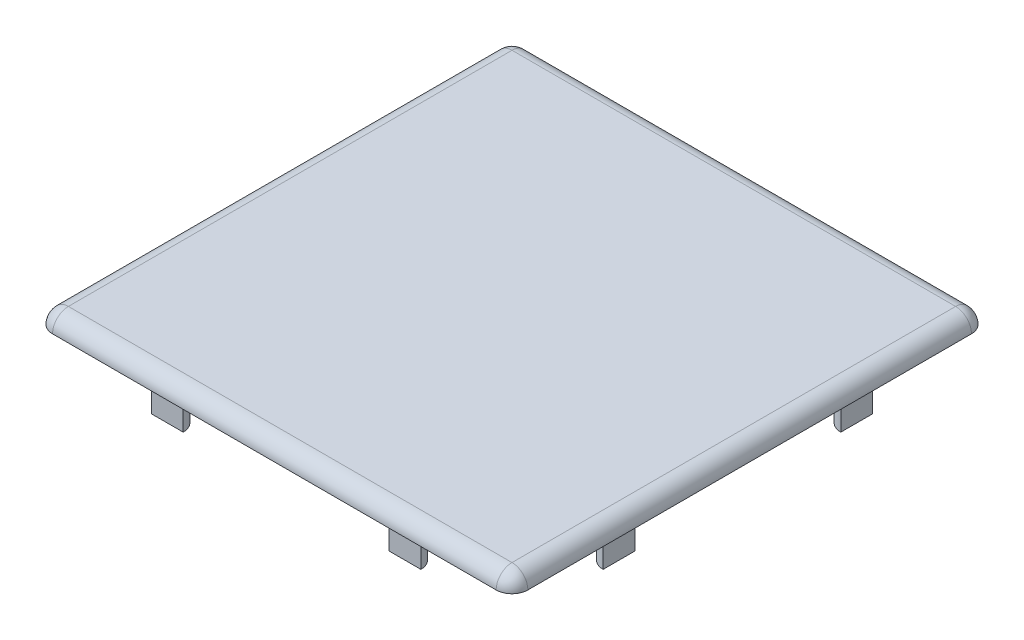
ISO-10303-21;
HEADER;
FILE_DESCRIPTION(('STEP AP214'),'2;1');
FILE_NAME('part.step','',(''),(''),'','','');
FILE_SCHEMA(('AUTOMOTIVE_DESIGN { 1 0 10303 214 1 1 1 1 }'));
ENDSEC;
DATA;
#1=APPLICATION_CONTEXT('core data for automotive mechanical design processes');
#2=APPLICATION_PROTOCOL_DEFINITION('international standard','automotive_design',2000,#1);
#3=PRODUCT_CONTEXT('',#1,'mechanical');
#4=PRODUCT('Part','Part','',(#3));
#5=PRODUCT_RELATED_PRODUCT_CATEGORY('part','',(#4));
#6=PRODUCT_DEFINITION_FORMATION('','',#4);
#7=PRODUCT_DEFINITION_CONTEXT('part definition',#1,'design');
#8=PRODUCT_DEFINITION('design','',#6,#7);
#9=PRODUCT_DEFINITION_SHAPE('','',#8);
#10=(LENGTH_UNIT() NAMED_UNIT(*) SI_UNIT(.MILLI.,.METRE.));
#11=(NAMED_UNIT(*) PLANE_ANGLE_UNIT() SI_UNIT($,.RADIAN.));
#12=(NAMED_UNIT(*) SI_UNIT($,.STERADIAN.) SOLID_ANGLE_UNIT());
#13=UNCERTAINTY_MEASURE_WITH_UNIT(LENGTH_MEASURE(1.E-05),#10,'distance_accuracy_value','');
#14=(GEOMETRIC_REPRESENTATION_CONTEXT(3) GLOBAL_UNCERTAINTY_ASSIGNED_CONTEXT((#13)) GLOBAL_UNIT_ASSIGNED_CONTEXT((#10,
#11,#12)) REPRESENTATION_CONTEXT('',''));
#15=CARTESIAN_POINT('',(0.,0.,0.));
#16=DIRECTION('',(0.,0.,1.));
#17=DIRECTION('',(1.,0.,0.));
#18=AXIS2_PLACEMENT_3D('',#15,#16,#17);
#19=CARTESIAN_POINT('',(0.,0.,0.));
#20=DIRECTION('',(0.,1.,0.));
#21=DIRECTION('',(0.,0.,1.));
#22=AXIS2_PLACEMENT_3D('',#19,#20,#21);
#23=PLANE('',#22);
#24=CARTESIAN_POINT('',(-15.,0.,28.5));
#25=DIRECTION('',(0.,-1.,0.));
#26=DIRECTION('',(0.,0.,-1.));
#27=AXIS2_PLACEMENT_3D('',#24,#25,#26);
#28=CIRCLE('',#27,2.);
#29=CARTESIAN_POINT('',(-17.,0.,28.5));
#30=VERTEX_POINT('',#29);
#31=CARTESIAN_POINT('',(-13.,0.,28.5));
#32=VERTEX_POINT('',#31);
#33=EDGE_CURVE('E240',#30,#32,#28,.T.);
#34=ORIENTED_EDGE('',*,*,#33,.F.);
#35=DIRECTION('',(-1.,0.,0.));
#36=VECTOR('',#35,1.);
#37=CARTESIAN_POINT('',(-13.,0.,28.5));
#38=LINE('',#37,#36);
#39=EDGE_CURVE('E245',#32,#30,#38,.T.);
#40=ORIENTED_EDGE('',*,*,#39,.F.);
#41=EDGE_LOOP('',(#34,#40));
#42=FACE_BOUND('',#41,.T.);
#43=CARTESIAN_POINT('',(-28.5,0.,15.));
#44=DIRECTION('',(0.,-1.,0.));
#45=DIRECTION('',(0.,0.,-1.));
#46=AXIS2_PLACEMENT_3D('',#43,#44,#45);
#47=CIRCLE('',#46,2.);
#48=CARTESIAN_POINT('',(-28.5,0.,13.));
#49=VERTEX_POINT('',#48);
#50=CARTESIAN_POINT('',(-28.5,0.,17.));
#51=VERTEX_POINT('',#50);
#52=EDGE_CURVE('E308',#49,#51,#47,.T.);
#53=ORIENTED_EDGE('',*,*,#52,.F.);
#54=DIRECTION('',(0.,0.,-1.));
#55=VECTOR('',#54,1.);
#56=CARTESIAN_POINT('',(-28.5,0.,13.));
#57=LINE('',#56,#55);
#58=EDGE_CURVE('E313',#51,#49,#57,.T.);
#59=ORIENTED_EDGE('',*,*,#58,.F.);
#60=EDGE_LOOP('',(#53,#59));
#61=FACE_BOUND('',#60,.T.);
#62=DIRECTION('',(0.,0.,-1.));
#63=VECTOR('',#62,1.);
#64=CARTESIAN_POINT('',(30.,0.,-30.));
#65=LINE('',#64,#63);
#66=CARTESIAN_POINT('',(30.,0.,28.));
#67=VERTEX_POINT('',#66);
#68=CARTESIAN_POINT('',(30.,0.,-28.));
#69=VERTEX_POINT('',#68);
#70=EDGE_CURVE('E332',#67,#69,#65,.T.);
#71=ORIENTED_EDGE('',*,*,#70,.F.);
#72=CARTESIAN_POINT('',(28.,0.,28.));
#73=DIRECTION('',(0.,1.,0.));
#74=DIRECTION('',(0.,0.,1.));
#75=AXIS2_PLACEMENT_3D('',#72,#73,#74);
#76=CIRCLE('',#75,2.);
#77=CARTESIAN_POINT('',(28.,0.,30.));
#78=VERTEX_POINT('',#77);
#79=EDGE_CURVE('E11',#67,#78,#76,.F.);
#80=ORIENTED_EDGE('',*,*,#79,.T.);
#81=DIRECTION('',(1.,0.,0.));
#82=VECTOR('',#81,1.);
#83=CARTESIAN_POINT('',(30.,0.,30.));
#84=LINE('',#83,#82);
#85=CARTESIAN_POINT('',(-28.,0.,30.));
#86=VERTEX_POINT('',#85);
#87=EDGE_CURVE('E329',#86,#78,#84,.T.);
#88=ORIENTED_EDGE('',*,*,#87,.F.);
#89=CARTESIAN_POINT('',(-28.,0.,28.));
#90=DIRECTION('',(0.,1.,0.));
#91=DIRECTION('',(0.,0.,1.));
#92=AXIS2_PLACEMENT_3D('',#89,#90,#91);
#93=CIRCLE('',#92,2.);
#94=CARTESIAN_POINT('',(-30.,0.,28.));
#95=VERTEX_POINT('',#94);
#96=EDGE_CURVE('E344',#86,#95,#93,.F.);
#97=ORIENTED_EDGE('',*,*,#96,.T.);
#98=DIRECTION('',(0.,0.,1.));
#99=VECTOR('',#98,1.);
#100=CARTESIAN_POINT('',(-30.,0.,-30.));
#101=LINE('',#100,#99);
#102=CARTESIAN_POINT('',(-30.,0.,-28.));
#103=VERTEX_POINT('',#102);
#104=EDGE_CURVE('E326',#103,#95,#101,.T.);
#105=ORIENTED_EDGE('',*,*,#104,.F.);
#106=CARTESIAN_POINT('',(-28.,0.,-28.));
#107=DIRECTION('',(0.,1.,0.));
#108=DIRECTION('',(0.,0.,1.));
#109=AXIS2_PLACEMENT_3D('',#106,#107,#108);
#110=CIRCLE('',#109,2.);
#111=CARTESIAN_POINT('',(-28.,0.,-30.));
#112=VERTEX_POINT('',#111);
#113=EDGE_CURVE('E51',#103,#112,#110,.F.);
#114=ORIENTED_EDGE('',*,*,#113,.T.);
#115=DIRECTION('',(-1.,0.,0.));
#116=VECTOR('',#115,1.);
#117=CARTESIAN_POINT('',(30.,0.,-30.));
#118=LINE('',#117,#116);
#119=CARTESIAN_POINT('',(28.,0.,-30.));
#120=VERTEX_POINT('',#119);
#121=EDGE_CURVE('E56',#120,#112,#118,.T.);
#122=ORIENTED_EDGE('',*,*,#121,.F.);
#123=CARTESIAN_POINT('',(28.,0.,-28.));
#124=DIRECTION('',(0.,1.,0.));
#125=DIRECTION('',(0.,0.,1.));
#126=AXIS2_PLACEMENT_3D('',#123,#124,#125);
#127=CIRCLE('',#126,2.);
#128=EDGE_CURVE('E43',#120,#69,#127,.F.);
#129=ORIENTED_EDGE('',*,*,#128,.T.);
#130=EDGE_LOOP('',(#71,#80,#88,#97,#105,#114,#122,#129));
#131=FACE_BOUND('',#130,.T.);
#132=DIRECTION('',(0.,0.,1.));
#133=VECTOR('',#132,1.);
#134=CARTESIAN_POINT('',(-28.5,0.,-13.));
#135=LINE('',#134,#133);
#136=CARTESIAN_POINT('',(-28.5,0.,-17.));
#137=VERTEX_POINT('',#136);
#138=CARTESIAN_POINT('',(-28.5,0.,-13.));
#139=VERTEX_POINT('',#138);
#140=EDGE_CURVE('E296',#137,#139,#135,.T.);
#141=ORIENTED_EDGE('',*,*,#140,.T.);
#142=CARTESIAN_POINT('',(-28.5,0.,-15.));
#143=DIRECTION('',(0.,1.,0.));
#144=DIRECTION('',(0.,0.,1.));
#145=AXIS2_PLACEMENT_3D('',#142,#143,#144);
#146=CIRCLE('',#145,2.);
#147=EDGE_CURVE('E291',#139,#137,#146,.T.);
#148=ORIENTED_EDGE('',*,*,#147,.T.);
#149=EDGE_LOOP('',(#141,#148));
#150=FACE_BOUND('',#149,.T.);
#151=DIRECTION('',(0.,0.,-1.));
#152=VECTOR('',#151,1.);
#153=CARTESIAN_POINT('',(28.5,0.,13.));
#154=LINE('',#153,#152);
#155=CARTESIAN_POINT('',(28.5,0.,17.));
#156=VERTEX_POINT('',#155);
#157=CARTESIAN_POINT('',(28.5,0.,13.));
#158=VERTEX_POINT('',#157);
#159=EDGE_CURVE('E279',#156,#158,#154,.T.);
#160=ORIENTED_EDGE('',*,*,#159,.T.);
#161=CARTESIAN_POINT('',(28.5,0.,15.));
#162=DIRECTION('',(0.,1.,0.));
#163=DIRECTION('',(0.,0.,-1.));
#164=AXIS2_PLACEMENT_3D('',#161,#162,#163);
#165=CIRCLE('',#164,2.);
#166=EDGE_CURVE('E274',#158,#156,#165,.T.);
#167=ORIENTED_EDGE('',*,*,#166,.T.);
#168=EDGE_LOOP('',(#160,#167));
#169=FACE_BOUND('',#168,.T.);
#170=CARTESIAN_POINT('',(28.5,0.,-15.));
#171=DIRECTION('',(0.,-1.,0.));
#172=DIRECTION('',(0.,0.,1.));
#173=AXIS2_PLACEMENT_3D('',#170,#171,#172);
#174=CIRCLE('',#173,2.);
#175=CARTESIAN_POINT('',(28.5,0.,-13.));
#176=VERTEX_POINT('',#175);
#177=CARTESIAN_POINT('',(28.5,0.,-17.));
#178=VERTEX_POINT('',#177);
#179=EDGE_CURVE('E257',#176,#178,#174,.T.);
#180=ORIENTED_EDGE('',*,*,#179,.F.);
#181=DIRECTION('',(0.,0.,1.));
#182=VECTOR('',#181,1.);
#183=CARTESIAN_POINT('',(28.5,0.,-13.));
#184=LINE('',#183,#182);
#185=EDGE_CURVE('E262',#178,#176,#184,.T.);
#186=ORIENTED_EDGE('',*,*,#185,.F.);
#187=EDGE_LOOP('',(#180,#186));
#188=FACE_BOUND('',#187,.T.);
#189=DIRECTION('',(1.,0.,0.));
#190=VECTOR('',#189,1.);
#191=CARTESIAN_POINT('',(13.,0.,28.5));
#192=LINE('',#191,#190);
#193=CARTESIAN_POINT('',(13.,0.,28.5));
#194=VERTEX_POINT('',#193);
#195=CARTESIAN_POINT('',(17.,0.,28.5));
#196=VERTEX_POINT('',#195);
#197=EDGE_CURVE('E228',#194,#196,#192,.T.);
#198=ORIENTED_EDGE('',*,*,#197,.T.);
#199=CARTESIAN_POINT('',(15.,0.,28.5));
#200=DIRECTION('',(0.,1.,0.));
#201=DIRECTION('',(0.,0.,-1.));
#202=AXIS2_PLACEMENT_3D('',#199,#200,#201);
#203=CIRCLE('',#202,2.);
#204=EDGE_CURVE('E223',#196,#194,#203,.T.);
#205=ORIENTED_EDGE('',*,*,#204,.T.);
#206=EDGE_LOOP('',(#198,#205));
#207=FACE_BOUND('',#206,.T.);
#208=DIRECTION('',(-1.,0.,0.));
#209=VECTOR('',#208,1.);
#210=CARTESIAN_POINT('',(-13.,0.,-28.5));
#211=LINE('',#210,#209);
#212=CARTESIAN_POINT('',(-13.,0.,-28.5));
#213=VERTEX_POINT('',#212);
#214=CARTESIAN_POINT('',(-17.,0.,-28.5));
#215=VERTEX_POINT('',#214);
#216=EDGE_CURVE('E205',#213,#215,#211,.T.);
#217=ORIENTED_EDGE('',*,*,#216,.T.);
#218=CARTESIAN_POINT('',(-15.,0.,-28.5));
#219=DIRECTION('',(0.,1.,0.));
#220=DIRECTION('',(0.,0.,1.));
#221=AXIS2_PLACEMENT_3D('',#218,#219,#220);
#222=CIRCLE('',#221,2.);
#223=EDGE_CURVE('E202',#215,#213,#222,.T.);
#224=ORIENTED_EDGE('',*,*,#223,.T.);
#225=EDGE_LOOP('',(#217,#224));
#226=FACE_BOUND('',#225,.T.);
#227=CARTESIAN_POINT('',(15.,0.,-28.5));
#228=DIRECTION('',(0.,-1.,0.));
#229=DIRECTION('',(0.,0.,1.));
#230=AXIS2_PLACEMENT_3D('',#227,#228,#229);
#231=CIRCLE('',#230,2.);
#232=CARTESIAN_POINT('',(17.,0.,-28.5));
#233=VERTEX_POINT('',#232);
#234=CARTESIAN_POINT('',(13.,0.,-28.5));
#235=VERTEX_POINT('',#234);
#236=EDGE_CURVE('E201',#233,#235,#231,.T.);
#237=ORIENTED_EDGE('',*,*,#236,.F.);
#238=DIRECTION('',(1.,0.,0.));
#239=VECTOR('',#238,1.);
#240=CARTESIAN_POINT('',(13.,0.,-28.5));
#241=LINE('',#240,#239);
#242=EDGE_CURVE('E198',#235,#233,#241,.T.);
#243=ORIENTED_EDGE('',*,*,#242,.F.);
#244=EDGE_LOOP('',(#237,#243));
#245=FACE_BOUND('',#244,.T.);
#246=ADVANCED_FACE('F34',(#42,#61,#131,#150,#169,#188,#207,#226,#245),#23,.F.);
#247=CARTESIAN_POINT('',(0.,2.,0.));
#248=DIRECTION('',(0.,1.,0.));
#249=DIRECTION('',(0.,0.,1.));
#250=AXIS2_PLACEMENT_3D('',#247,#248,#249);
#251=PLANE('',#250);
#252=DIRECTION('',(1.,0.,0.));
#253=VECTOR('',#252,1.);
#254=CARTESIAN_POINT('',(30.,2.,28.));
#255=LINE('',#254,#253);
#256=CARTESIAN_POINT('',(-28.,2.,28.));
#257=VERTEX_POINT('',#256);
#258=CARTESIAN_POINT('',(28.,2.,28.));
#259=VERTEX_POINT('',#258);
#260=EDGE_CURVE('E339',#257,#259,#255,.T.);
#261=ORIENTED_EDGE('',*,*,#260,.T.);
#262=DIRECTION('',(0.,0.,-1.));
#263=VECTOR('',#262,1.);
#264=CARTESIAN_POINT('',(28.,2.,-30.));
#265=LINE('',#264,#263);
#266=CARTESIAN_POINT('',(28.,2.,-28.));
#267=VERTEX_POINT('',#266);
#268=EDGE_CURVE('E341',#259,#267,#265,.T.);
#269=ORIENTED_EDGE('',*,*,#268,.T.);
#270=DIRECTION('',(-1.,0.,0.));
#271=VECTOR('',#270,1.);
#272=CARTESIAN_POINT('',(-30.,2.,-28.));
#273=LINE('',#272,#271);
#274=CARTESIAN_POINT('',(-28.,2.,-28.));
#275=VERTEX_POINT('',#274);
#276=EDGE_CURVE('E335',#267,#275,#273,.T.);
#277=ORIENTED_EDGE('',*,*,#276,.T.);
#278=DIRECTION('',(0.,0.,1.));
#279=VECTOR('',#278,1.);
#280=CARTESIAN_POINT('',(-28.,2.,30.));
#281=LINE('',#280,#279);
#282=EDGE_CURVE('E337',#275,#257,#281,.T.);
#283=ORIENTED_EDGE('',*,*,#282,.T.);
#284=EDGE_LOOP('',(#261,#269,#277,#283));
#285=FACE_BOUND('',#284,.T.);
#286=ADVANCED_FACE('F375',(#285),#251,.T.);
#287=CARTESIAN_POINT('',(-28.5,-4.,15.));
#288=DIRECTION('',(0.,1.,0.));
#289=DIRECTION('',(0.,0.,1.));
#290=AXIS2_PLACEMENT_3D('',#287,#288,#289);
#291=CYLINDRICAL_SURFACE('',#290,2.);
#292=ORIENTED_EDGE('',*,*,#52,.T.);
#293=DIRECTION('',(0.,1.,0.));
#294=VECTOR('',#293,1.);
#295=CARTESIAN_POINT('',(-28.5,-4.,17.));
#296=LINE('',#295,#294);
#297=CARTESIAN_POINT('',(-28.5,-4.,17.));
#298=VERTEX_POINT('',#297);
#299=EDGE_CURVE('E322',#298,#51,#296,.T.);
#300=ORIENTED_EDGE('',*,*,#299,.F.);
#301=CARTESIAN_POINT('',(-28.5,-4.,15.));
#302=DIRECTION('',(0.,-1.,0.));
#303=DIRECTION('',(0.,0.,-1.));
#304=AXIS2_PLACEMENT_3D('',#301,#302,#303);
#305=CIRCLE('',#304,2.);
#306=CARTESIAN_POINT('',(-28.5,-4.,13.));
#307=VERTEX_POINT('',#306);
#308=EDGE_CURVE('E309',#307,#298,#305,.T.);
#309=ORIENTED_EDGE('',*,*,#308,.F.);
#310=DIRECTION('',(0.,1.,0.));
#311=VECTOR('',#310,1.);
#312=CARTESIAN_POINT('',(-28.5,-4.,13.));
#313=LINE('',#312,#311);
#314=EDGE_CURVE('E315',#307,#49,#313,.T.);
#315=ORIENTED_EDGE('',*,*,#314,.T.);
#316=EDGE_LOOP('',(#292,#300,#309,#315));
#317=FACE_BOUND('',#316,.T.);
#318=ADVANCED_FACE('F381',(#317),#291,.T.);
#319=CARTESIAN_POINT('',(-28.5,-4.,13.));
#320=DIRECTION('',(1.,0.,0.));
#321=DIRECTION('',(0.,0.,-1.));
#322=AXIS2_PLACEMENT_3D('',#319,#320,#321);
#323=PLANE('',#322);
#324=ORIENTED_EDGE('',*,*,#58,.T.);
#325=ORIENTED_EDGE('',*,*,#314,.F.);
#326=DIRECTION('',(0.,0.,-1.));
#327=VECTOR('',#326,1.);
#328=CARTESIAN_POINT('',(-28.5,-4.,13.));
#329=LINE('',#328,#327);
#330=EDGE_CURVE('E312',#298,#307,#329,.T.);
#331=ORIENTED_EDGE('',*,*,#330,.F.);
#332=ORIENTED_EDGE('',*,*,#299,.T.);
#333=EDGE_LOOP('',(#324,#325,#331,#332));
#334=FACE_BOUND('',#333,.T.);
#335=ADVANCED_FACE('F521',(#334),#323,.F.);
#336=CARTESIAN_POINT('',(-28.5,-4.,15.));
#337=DIRECTION('',(0.,-1.,0.));
#338=DIRECTION('',(0.,0.,-1.));
#339=AXIS2_PLACEMENT_3D('',#336,#337,#338);
#340=PLANE('',#339);
#341=ORIENTED_EDGE('',*,*,#308,.T.);
#342=ORIENTED_EDGE('',*,*,#330,.T.);
#343=EDGE_LOOP('',(#341,#342));
#344=FACE_BOUND('',#343,.T.);
#345=ADVANCED_FACE('F517',(#344),#340,.T.);
#346=CARTESIAN_POINT('',(-28.5,-4.,-15.));
#347=DIRECTION('',(0.,1.,0.));
#348=DIRECTION('',(0.,0.,1.));
#349=AXIS2_PLACEMENT_3D('',#346,#347,#348);
#350=CYLINDRICAL_SURFACE('',#349,2.);
#351=ORIENTED_EDGE('',*,*,#147,.F.);
#352=DIRECTION('',(0.,1.,0.));
#353=VECTOR('',#352,1.);
#354=CARTESIAN_POINT('',(-28.5,-4.,-13.));
#355=LINE('',#354,#353);
#356=CARTESIAN_POINT('',(-28.5,-4.,-13.));
#357=VERTEX_POINT('',#356);
#358=EDGE_CURVE('E305',#357,#139,#355,.T.);
#359=ORIENTED_EDGE('',*,*,#358,.F.);
#360=CARTESIAN_POINT('',(-28.5,-4.,-15.));
#361=DIRECTION('',(0.,1.,0.));
#362=DIRECTION('',(0.,0.,1.));
#363=AXIS2_PLACEMENT_3D('',#360,#361,#362);
#364=CIRCLE('',#363,2.);
#365=CARTESIAN_POINT('',(-28.5,-4.,-17.));
#366=VERTEX_POINT('',#365);
#367=EDGE_CURVE('E292',#357,#366,#364,.T.);
#368=ORIENTED_EDGE('',*,*,#367,.T.);
#369=DIRECTION('',(0.,1.,0.));
#370=VECTOR('',#369,1.);
#371=CARTESIAN_POINT('',(-28.5,-4.,-17.));
#372=LINE('',#371,#370);
#373=EDGE_CURVE('E299',#366,#137,#372,.T.);
#374=ORIENTED_EDGE('',*,*,#373,.T.);
#375=EDGE_LOOP('',(#351,#359,#368,#374));
#376=FACE_BOUND('',#375,.T.);
#377=ADVANCED_FACE('F513',(#376),#350,.T.);
#378=CARTESIAN_POINT('',(-28.5,-4.,-13.));
#379=DIRECTION('',(-1.,0.,0.));
#380=DIRECTION('',(0.,0.,1.));
#381=AXIS2_PLACEMENT_3D('',#378,#379,#380);
#382=PLANE('',#381);
#383=ORIENTED_EDGE('',*,*,#140,.F.);
#384=ORIENTED_EDGE('',*,*,#373,.F.);
#385=DIRECTION('',(0.,0.,1.));
#386=VECTOR('',#385,1.);
#387=CARTESIAN_POINT('',(-28.5,-4.,-13.));
#388=LINE('',#387,#386);
#389=EDGE_CURVE('E295',#366,#357,#388,.T.);
#390=ORIENTED_EDGE('',*,*,#389,.T.);
#391=ORIENTED_EDGE('',*,*,#358,.T.);
#392=EDGE_LOOP('',(#383,#384,#390,#391));
#393=FACE_BOUND('',#392,.T.);
#394=ADVANCED_FACE('F509',(#393),#382,.T.);
#395=CARTESIAN_POINT('',(-28.5,-4.,-15.));
#396=DIRECTION('',(0.,-1.,0.));
#397=DIRECTION('',(0.,0.,1.));
#398=AXIS2_PLACEMENT_3D('',#395,#396,#397);
#399=PLANE('',#398);
#400=ORIENTED_EDGE('',*,*,#367,.F.);
#401=ORIENTED_EDGE('',*,*,#389,.F.);
#402=EDGE_LOOP('',(#400,#401));
#403=FACE_BOUND('',#402,.T.);
#404=ADVANCED_FACE('F505',(#403),#399,.T.);
#405=CARTESIAN_POINT('',(28.5,-4.,15.));
#406=DIRECTION('',(0.,1.,0.));
#407=DIRECTION('',(0.,0.,1.));
#408=AXIS2_PLACEMENT_3D('',#405,#406,#407);
#409=CYLINDRICAL_SURFACE('',#408,2.);
#410=ORIENTED_EDGE('',*,*,#166,.F.);
#411=DIRECTION('',(0.,1.,0.));
#412=VECTOR('',#411,1.);
#413=CARTESIAN_POINT('',(28.5,-4.,13.));
#414=LINE('',#413,#412);
#415=CARTESIAN_POINT('',(28.5,-4.,13.));
#416=VERTEX_POINT('',#415);
#417=EDGE_CURVE('E288',#416,#158,#414,.T.);
#418=ORIENTED_EDGE('',*,*,#417,.F.);
#419=CARTESIAN_POINT('',(28.5,-4.,15.));
#420=DIRECTION('',(0.,1.,0.));
#421=DIRECTION('',(0.,0.,-1.));
#422=AXIS2_PLACEMENT_3D('',#419,#420,#421);
#423=CIRCLE('',#422,2.);
#424=CARTESIAN_POINT('',(28.5,-4.,17.));
#425=VERTEX_POINT('',#424);
#426=EDGE_CURVE('E275',#416,#425,#423,.T.);
#427=ORIENTED_EDGE('',*,*,#426,.T.);
#428=DIRECTION('',(0.,1.,0.));
#429=VECTOR('',#428,1.);
#430=CARTESIAN_POINT('',(28.5,-4.,17.));
#431=LINE('',#430,#429);
#432=EDGE_CURVE('E282',#425,#156,#431,.T.);
#433=ORIENTED_EDGE('',*,*,#432,.T.);
#434=EDGE_LOOP('',(#410,#418,#427,#433));
#435=FACE_BOUND('',#434,.T.);
#436=ADVANCED_FACE('F501',(#435),#409,.T.);
#437=CARTESIAN_POINT('',(28.5,-4.,13.));
#438=DIRECTION('',(1.,0.,0.));
#439=DIRECTION('',(0.,0.,-1.));
#440=AXIS2_PLACEMENT_3D('',#437,#438,#439);
#441=PLANE('',#440);
#442=ORIENTED_EDGE('',*,*,#159,.F.);
#443=ORIENTED_EDGE('',*,*,#432,.F.);
#444=DIRECTION('',(0.,0.,-1.));
#445=VECTOR('',#444,1.);
#446=CARTESIAN_POINT('',(28.5,-4.,13.));
#447=LINE('',#446,#445);
#448=EDGE_CURVE('E278',#425,#416,#447,.T.);
#449=ORIENTED_EDGE('',*,*,#448,.T.);
#450=ORIENTED_EDGE('',*,*,#417,.T.);
#451=EDGE_LOOP('',(#442,#443,#449,#450));
#452=FACE_BOUND('',#451,.T.);
#453=ADVANCED_FACE('F497',(#452),#441,.T.);
#454=CARTESIAN_POINT('',(28.5,-4.,15.));
#455=DIRECTION('',(0.,-1.,0.));
#456=DIRECTION('',(0.,0.,-1.));
#457=AXIS2_PLACEMENT_3D('',#454,#455,#456);
#458=PLANE('',#457);
#459=ORIENTED_EDGE('',*,*,#426,.F.);
#460=ORIENTED_EDGE('',*,*,#448,.F.);
#461=EDGE_LOOP('',(#459,#460));
#462=FACE_BOUND('',#461,.T.);
#463=ADVANCED_FACE('F493',(#462),#458,.T.);
#464=CARTESIAN_POINT('',(28.5,-4.,-15.));
#465=DIRECTION('',(0.,1.,0.));
#466=DIRECTION('',(0.,0.,1.));
#467=AXIS2_PLACEMENT_3D('',#464,#465,#466);
#468=CYLINDRICAL_SURFACE('',#467,2.);
#469=ORIENTED_EDGE('',*,*,#179,.T.);
#470=DIRECTION('',(0.,1.,0.));
#471=VECTOR('',#470,1.);
#472=CARTESIAN_POINT('',(28.5,-4.,-17.));
#473=LINE('',#472,#471);
#474=CARTESIAN_POINT('',(28.5,-4.,-17.));
#475=VERTEX_POINT('',#474);
#476=EDGE_CURVE('E271',#475,#178,#473,.T.);
#477=ORIENTED_EDGE('',*,*,#476,.F.);
#478=CARTESIAN_POINT('',(28.5,-4.,-15.));
#479=DIRECTION('',(0.,-1.,0.));
#480=DIRECTION('',(0.,0.,1.));
#481=AXIS2_PLACEMENT_3D('',#478,#479,#480);
#482=CIRCLE('',#481,2.);
#483=CARTESIAN_POINT('',(28.5,-4.,-13.));
#484=VERTEX_POINT('',#483);
#485=EDGE_CURVE('E258',#484,#475,#482,.T.);
#486=ORIENTED_EDGE('',*,*,#485,.F.);
#487=DIRECTION('',(0.,1.,0.));
#488=VECTOR('',#487,1.);
#489=CARTESIAN_POINT('',(28.5,-4.,-13.));
#490=LINE('',#489,#488);
#491=EDGE_CURVE('E264',#484,#176,#490,.T.);
#492=ORIENTED_EDGE('',*,*,#491,.T.);
#493=EDGE_LOOP('',(#469,#477,#486,#492));
#494=FACE_BOUND('',#493,.T.);
#495=ADVANCED_FACE('F489',(#494),#468,.T.);
#496=CARTESIAN_POINT('',(28.5,-4.,-13.));
#497=DIRECTION('',(-1.,0.,0.));
#498=DIRECTION('',(0.,0.,1.));
#499=AXIS2_PLACEMENT_3D('',#496,#497,#498);
#500=PLANE('',#499);
#501=ORIENTED_EDGE('',*,*,#185,.T.);
#502=ORIENTED_EDGE('',*,*,#491,.F.);
#503=DIRECTION('',(0.,0.,1.));
#504=VECTOR('',#503,1.);
#505=CARTESIAN_POINT('',(28.5,-4.,-13.));
#506=LINE('',#505,#504);
#507=EDGE_CURVE('E261',#475,#484,#506,.T.);
#508=ORIENTED_EDGE('',*,*,#507,.F.);
#509=ORIENTED_EDGE('',*,*,#476,.T.);
#510=EDGE_LOOP('',(#501,#502,#508,#509));
#511=FACE_BOUND('',#510,.T.);
#512=ADVANCED_FACE('F485',(#511),#500,.F.);
#513=CARTESIAN_POINT('',(28.5,-4.,-15.));
#514=DIRECTION('',(0.,-1.,0.));
#515=DIRECTION('',(0.,0.,1.));
#516=AXIS2_PLACEMENT_3D('',#513,#514,#515);
#517=PLANE('',#516);
#518=ORIENTED_EDGE('',*,*,#485,.T.);
#519=ORIENTED_EDGE('',*,*,#507,.T.);
#520=EDGE_LOOP('',(#518,#519));
#521=FACE_BOUND('',#520,.T.);
#522=ADVANCED_FACE('F481',(#521),#517,.T.);
#523=CARTESIAN_POINT('',(-15.,-4.,28.5));
#524=DIRECTION('',(0.,1.,0.));
#525=DIRECTION('',(0.,0.,1.));
#526=AXIS2_PLACEMENT_3D('',#523,#524,#525);
#527=CYLINDRICAL_SURFACE('',#526,2.);
#528=ORIENTED_EDGE('',*,*,#33,.T.);
#529=DIRECTION('',(0.,1.,0.));
#530=VECTOR('',#529,1.);
#531=CARTESIAN_POINT('',(-13.,-4.,28.5));
#532=LINE('',#531,#530);
#533=CARTESIAN_POINT('',(-13.,-4.,28.5));
#534=VERTEX_POINT('',#533);
#535=EDGE_CURVE('E254',#534,#32,#532,.T.);
#536=ORIENTED_EDGE('',*,*,#535,.F.);
#537=CARTESIAN_POINT('',(-15.,-4.,28.5));
#538=DIRECTION('',(0.,-1.,0.));
#539=DIRECTION('',(0.,0.,-1.));
#540=AXIS2_PLACEMENT_3D('',#537,#538,#539);
#541=CIRCLE('',#540,2.);
#542=CARTESIAN_POINT('',(-17.,-4.,28.5));
#543=VERTEX_POINT('',#542);
#544=EDGE_CURVE('E241',#543,#534,#541,.T.);
#545=ORIENTED_EDGE('',*,*,#544,.F.);
#546=DIRECTION('',(0.,1.,0.));
#547=VECTOR('',#546,1.);
#548=CARTESIAN_POINT('',(-17.,-4.,28.5));
#549=LINE('',#548,#547);
#550=EDGE_CURVE('E247',#543,#30,#549,.T.);
#551=ORIENTED_EDGE('',*,*,#550,.T.);
#552=EDGE_LOOP('',(#528,#536,#545,#551));
#553=FACE_BOUND('',#552,.T.);
#554=ADVANCED_FACE('F477',(#553),#527,.T.);
#555=CARTESIAN_POINT('',(-13.,-4.,28.5));
#556=DIRECTION('',(0.,0.,-1.));
#557=DIRECTION('',(-1.,0.,0.));
#558=AXIS2_PLACEMENT_3D('',#555,#556,#557);
#559=PLANE('',#558);
#560=ORIENTED_EDGE('',*,*,#39,.T.);
#561=ORIENTED_EDGE('',*,*,#550,.F.);
#562=DIRECTION('',(-1.,0.,0.));
#563=VECTOR('',#562,1.);
#564=CARTESIAN_POINT('',(-13.,-4.,28.5));
#565=LINE('',#564,#563);
#566=EDGE_CURVE('E244',#534,#543,#565,.T.);
#567=ORIENTED_EDGE('',*,*,#566,.F.);
#568=ORIENTED_EDGE('',*,*,#535,.T.);
#569=EDGE_LOOP('',(#560,#561,#567,#568));
#570=FACE_BOUND('',#569,.T.);
#571=ADVANCED_FACE('F473',(#570),#559,.F.);
#572=CARTESIAN_POINT('',(-15.,-4.,28.5));
#573=DIRECTION('',(0.,-1.,0.));
#574=DIRECTION('',(0.,0.,-1.));
#575=AXIS2_PLACEMENT_3D('',#572,#573,#574);
#576=PLANE('',#575);
#577=ORIENTED_EDGE('',*,*,#544,.T.);
#578=ORIENTED_EDGE('',*,*,#566,.T.);
#579=EDGE_LOOP('',(#577,#578));
#580=FACE_BOUND('',#579,.T.);
#581=ADVANCED_FACE('F469',(#580),#576,.T.);
#582=CARTESIAN_POINT('',(15.,-4.,28.5));
#583=DIRECTION('',(0.,1.,0.));
#584=DIRECTION('',(0.,0.,1.));
#585=AXIS2_PLACEMENT_3D('',#582,#583,#584);
#586=CYLINDRICAL_SURFACE('',#585,2.);
#587=ORIENTED_EDGE('',*,*,#204,.F.);
#588=DIRECTION('',(0.,1.,0.));
#589=VECTOR('',#588,1.);
#590=CARTESIAN_POINT('',(17.,-4.,28.5));
#591=LINE('',#590,#589);
#592=CARTESIAN_POINT('',(17.,-4.,28.5));
#593=VERTEX_POINT('',#592);
#594=EDGE_CURVE('E237',#593,#196,#591,.T.);
#595=ORIENTED_EDGE('',*,*,#594,.F.);
#596=CARTESIAN_POINT('',(15.,-4.,28.5));
#597=DIRECTION('',(0.,1.,0.));
#598=DIRECTION('',(0.,0.,-1.));
#599=AXIS2_PLACEMENT_3D('',#596,#597,#598);
#600=CIRCLE('',#599,2.);
#601=CARTESIAN_POINT('',(13.,-4.,28.5));
#602=VERTEX_POINT('',#601);
#603=EDGE_CURVE('E224',#593,#602,#600,.T.);
#604=ORIENTED_EDGE('',*,*,#603,.T.);
#605=DIRECTION('',(0.,1.,0.));
#606=VECTOR('',#605,1.);
#607=CARTESIAN_POINT('',(13.,-4.,28.5));
#608=LINE('',#607,#606);
#609=EDGE_CURVE('E231',#602,#194,#608,.T.);
#610=ORIENTED_EDGE('',*,*,#609,.T.);
#611=EDGE_LOOP('',(#587,#595,#604,#610));
#612=FACE_BOUND('',#611,.T.);
#613=ADVANCED_FACE('F465',(#612),#586,.T.);
#614=CARTESIAN_POINT('',(13.,-4.,28.5));
#615=DIRECTION('',(0.,0.,1.));
#616=DIRECTION('',(1.,0.,0.));
#617=AXIS2_PLACEMENT_3D('',#614,#615,#616);
#618=PLANE('',#617);
#619=ORIENTED_EDGE('',*,*,#197,.F.);
#620=ORIENTED_EDGE('',*,*,#609,.F.);
#621=DIRECTION('',(1.,0.,0.));
#622=VECTOR('',#621,1.);
#623=CARTESIAN_POINT('',(13.,-4.,28.5));
#624=LINE('',#623,#622);
#625=EDGE_CURVE('E227',#602,#593,#624,.T.);
#626=ORIENTED_EDGE('',*,*,#625,.T.);
#627=ORIENTED_EDGE('',*,*,#594,.T.);
#628=EDGE_LOOP('',(#619,#620,#626,#627));
#629=FACE_BOUND('',#628,.T.);
#630=ADVANCED_FACE('F461',(#629),#618,.T.);
#631=CARTESIAN_POINT('',(15.,-4.,28.5));
#632=DIRECTION('',(0.,-1.,0.));
#633=DIRECTION('',(0.,0.,-1.));
#634=AXIS2_PLACEMENT_3D('',#631,#632,#633);
#635=PLANE('',#634);
#636=ORIENTED_EDGE('',*,*,#603,.F.);
#637=ORIENTED_EDGE('',*,*,#625,.F.);
#638=EDGE_LOOP('',(#636,#637));
#639=FACE_BOUND('',#638,.T.);
#640=ADVANCED_FACE('F458',(#639),#635,.T.);
#641=CARTESIAN_POINT('',(-15.,-4.,-28.5));
#642=DIRECTION('',(0.,1.,0.));
#643=DIRECTION('',(0.,0.,1.));
#644=AXIS2_PLACEMENT_3D('',#641,#642,#643);
#645=CYLINDRICAL_SURFACE('',#644,2.);
#646=ORIENTED_EDGE('',*,*,#223,.F.);
#647=DIRECTION('',(0.,1.,0.));
#648=VECTOR('',#647,1.);
#649=CARTESIAN_POINT('',(-17.,-4.,-28.5));
#650=LINE('',#649,#648);
#651=CARTESIAN_POINT('',(-17.,-4.,-28.5));
#652=VERTEX_POINT('',#651);
#653=EDGE_CURVE('E220',#652,#215,#650,.T.);
#654=ORIENTED_EDGE('',*,*,#653,.F.);
#655=CARTESIAN_POINT('',(-15.,-4.,-28.5));
#656=DIRECTION('',(0.,1.,0.));
#657=DIRECTION('',(0.,0.,1.));
#658=AXIS2_PLACEMENT_3D('',#655,#656,#657);
#659=CIRCLE('',#658,2.);
#660=CARTESIAN_POINT('',(-13.,-4.,-28.5));
#661=VERTEX_POINT('',#660);
#662=EDGE_CURVE('E210',#652,#661,#659,.T.);
#663=ORIENTED_EDGE('',*,*,#662,.T.);
#664=DIRECTION('',(0.,1.,0.));
#665=VECTOR('',#664,1.);
#666=CARTESIAN_POINT('',(-13.,-4.,-28.5));
#667=LINE('',#666,#665);
#668=EDGE_CURVE('E215',#661,#213,#667,.T.);
#669=ORIENTED_EDGE('',*,*,#668,.T.);
#670=EDGE_LOOP('',(#646,#654,#663,#669));
#671=FACE_BOUND('',#670,.T.);
#672=ADVANCED_FACE('F443',(#671),#645,.T.);
#673=CARTESIAN_POINT('',(-13.,-4.,-28.5));
#674=DIRECTION('',(0.,0.,-1.));
#675=DIRECTION('',(-1.,0.,0.));
#676=AXIS2_PLACEMENT_3D('',#673,#674,#675);
#677=PLANE('',#676);
#678=ORIENTED_EDGE('',*,*,#216,.F.);
#679=ORIENTED_EDGE('',*,*,#668,.F.);
#680=DIRECTION('',(-1.,0.,0.));
#681=VECTOR('',#680,1.);
#682=CARTESIAN_POINT('',(-13.,-4.,-28.5));
#683=LINE('',#682,#681);
#684=EDGE_CURVE('E213',#661,#652,#683,.T.);
#685=ORIENTED_EDGE('',*,*,#684,.T.);
#686=ORIENTED_EDGE('',*,*,#653,.T.);
#687=EDGE_LOOP('',(#678,#679,#685,#686));
#688=FACE_BOUND('',#687,.T.);
#689=ADVANCED_FACE('F439',(#688),#677,.T.);
#690=CARTESIAN_POINT('',(-15.,-4.,-28.5));
#691=DIRECTION('',(0.,-1.,0.));
#692=DIRECTION('',(0.,0.,1.));
#693=AXIS2_PLACEMENT_3D('',#690,#691,#692);
#694=PLANE('',#693);
#695=ORIENTED_EDGE('',*,*,#662,.F.);
#696=ORIENTED_EDGE('',*,*,#684,.F.);
#697=EDGE_LOOP('',(#695,#696));
#698=FACE_BOUND('',#697,.T.);
#699=ADVANCED_FACE('F445',(#698),#694,.T.);
#700=CARTESIAN_POINT('',(15.,-4.,-28.5));
#701=DIRECTION('',(0.,1.,0.));
#702=DIRECTION('',(0.,0.,1.));
#703=AXIS2_PLACEMENT_3D('',#700,#701,#702);
#704=CYLINDRICAL_SURFACE('',#703,2.);
#705=ORIENTED_EDGE('',*,*,#236,.T.);
#706=DIRECTION('',(0.,1.,0.));
#707=VECTOR('',#706,1.);
#708=CARTESIAN_POINT('',(13.,-4.,-28.5));
#709=LINE('',#708,#707);
#710=CARTESIAN_POINT('',(13.,-4.,-28.5));
#711=VERTEX_POINT('',#710);
#712=EDGE_CURVE('E188',#711,#235,#709,.T.);
#713=ORIENTED_EDGE('',*,*,#712,.F.);
#714=CARTESIAN_POINT('',(15.,-4.,-28.5));
#715=DIRECTION('',(0.,-1.,0.));
#716=DIRECTION('',(0.,0.,1.));
#717=AXIS2_PLACEMENT_3D('',#714,#715,#716);
#718=CIRCLE('',#717,2.);
#719=CARTESIAN_POINT('',(17.,-4.,-28.5));
#720=VERTEX_POINT('',#719);
#721=EDGE_CURVE('E194',#720,#711,#718,.T.);
#722=ORIENTED_EDGE('',*,*,#721,.F.);
#723=DIRECTION('',(0.,1.,0.));
#724=VECTOR('',#723,1.);
#725=CARTESIAN_POINT('',(17.,-4.,-28.5));
#726=LINE('',#725,#724);
#727=EDGE_CURVE('E191',#720,#233,#726,.T.);
#728=ORIENTED_EDGE('',*,*,#727,.T.);
#729=EDGE_LOOP('',(#705,#713,#722,#728));
#730=FACE_BOUND('',#729,.T.);
#731=ADVANCED_FACE('F200',(#730),#704,.T.);
#732=CARTESIAN_POINT('',(13.,-4.,-28.5));
#733=DIRECTION('',(0.,0.,1.));
#734=DIRECTION('',(1.,0.,0.));
#735=AXIS2_PLACEMENT_3D('',#732,#733,#734);
#736=PLANE('',#735);
#737=ORIENTED_EDGE('',*,*,#242,.T.);
#738=ORIENTED_EDGE('',*,*,#727,.F.);
#739=DIRECTION('',(1.,0.,0.));
#740=VECTOR('',#739,1.);
#741=CARTESIAN_POINT('',(13.,-4.,-28.5));
#742=LINE('',#741,#740);
#743=EDGE_CURVE('E183',#711,#720,#742,.T.);
#744=ORIENTED_EDGE('',*,*,#743,.F.);
#745=ORIENTED_EDGE('',*,*,#712,.T.);
#746=EDGE_LOOP('',(#737,#738,#744,#745));
#747=FACE_BOUND('',#746,.T.);
#748=ADVANCED_FACE('F186',(#747),#736,.F.);
#749=CARTESIAN_POINT('',(15.,-4.,-28.5));
#750=DIRECTION('',(0.,-1.,0.));
#751=DIRECTION('',(0.,0.,1.));
#752=AXIS2_PLACEMENT_3D('',#749,#750,#751);
#753=PLANE('',#752);
#754=ORIENTED_EDGE('',*,*,#721,.T.);
#755=ORIENTED_EDGE('',*,*,#743,.T.);
#756=EDGE_LOOP('',(#754,#755));
#757=FACE_BOUND('',#756,.T.);
#758=ADVANCED_FACE('F196',(#757),#753,.T.);
#759=CARTESIAN_POINT('',(-28.,0.,0.));
#760=DIRECTION('',(0.,0.,-1.));
#761=DIRECTION('',(-1.,0.,0.));
#762=AXIS2_PLACEMENT_3D('',#759,#760,#761);
#763=CYLINDRICAL_SURFACE('',#762,2.);
#764=CARTESIAN_POINT('',(-28.,0.,-28.));
#765=DIRECTION('',(0.,0.,-1.));
#766=DIRECTION('',(-1.,0.,0.));
#767=AXIS2_PLACEMENT_3D('',#764,#765,#766);
#768=CIRCLE('',#767,2.);
#769=EDGE_CURVE('E363',#103,#275,#768,.T.);
#770=ORIENTED_EDGE('',*,*,#769,.F.);
#771=ORIENTED_EDGE('',*,*,#104,.T.);
#772=CARTESIAN_POINT('',(-28.,0.,28.));
#773=DIRECTION('',(0.,0.,1.));
#774=DIRECTION('',(1.,0.,0.));
#775=AXIS2_PLACEMENT_3D('',#772,#773,#774);
#776=CIRCLE('',#775,2.);
#777=EDGE_CURVE('E38',#257,#95,#776,.T.);
#778=ORIENTED_EDGE('',*,*,#777,.F.);
#779=ORIENTED_EDGE('',*,*,#282,.F.);
#780=EDGE_LOOP('',(#770,#771,#778,#779));
#781=FACE_BOUND('',#780,.T.);
#782=ADVANCED_FACE('F36',(#781),#763,.T.);
#783=CARTESIAN_POINT('',(-28.,0.,28.));
#784=DIRECTION('',(0.,0.,1.));
#785=DIRECTION('',(1.,0.,0.));
#786=AXIS2_PLACEMENT_3D('',#783,#784,#785);
#787=SPHERICAL_SURFACE('',#786,2.);
#788=ORIENTED_EDGE('',*,*,#777,.T.);
#789=ORIENTED_EDGE('',*,*,#96,.F.);
#790=CARTESIAN_POINT('',(-28.,0.,28.));
#791=DIRECTION('',(-1.,0.,0.));
#792=DIRECTION('',(0.,0.,1.));
#793=AXIS2_PLACEMENT_3D('',#790,#791,#792);
#794=CIRCLE('',#793,2.);
#795=EDGE_CURVE('E361',#257,#86,#794,.F.);
#796=ORIENTED_EDGE('',*,*,#795,.F.);
#797=EDGE_LOOP('',(#788,#789,#796));
#798=FACE_BOUND('',#797,.T.);
#799=ADVANCED_FACE('F409',(#798),#787,.T.);
#800=CARTESIAN_POINT('',(-28.,0.,-28.));
#801=DIRECTION('',(0.,0.,1.));
#802=DIRECTION('',(1.,0.,0.));
#803=AXIS2_PLACEMENT_3D('',#800,#801,#802);
#804=SPHERICAL_SURFACE('',#803,2.);
#805=ORIENTED_EDGE('',*,*,#113,.F.);
#806=ORIENTED_EDGE('',*,*,#769,.T.);
#807=CARTESIAN_POINT('',(-28.,0.,-28.));
#808=DIRECTION('',(-1.,0.,0.));
#809=DIRECTION('',(0.,0.,1.));
#810=AXIS2_PLACEMENT_3D('',#807,#808,#809);
#811=CIRCLE('',#810,2.);
#812=EDGE_CURVE('E358',#112,#275,#811,.F.);
#813=ORIENTED_EDGE('',*,*,#812,.F.);
#814=EDGE_LOOP('',(#805,#806,#813));
#815=FACE_BOUND('',#814,.T.);
#816=ADVANCED_FACE('F406',(#815),#804,.T.);
#817=CARTESIAN_POINT('',(0.,0.,28.));
#818=DIRECTION('',(-1.,0.,0.));
#819=DIRECTION('',(0.,0.,1.));
#820=AXIS2_PLACEMENT_3D('',#817,#818,#819);
#821=CYLINDRICAL_SURFACE('',#820,2.);
#822=ORIENTED_EDGE('',*,*,#795,.T.);
#823=ORIENTED_EDGE('',*,*,#87,.T.);
#824=CARTESIAN_POINT('',(28.,0.,28.));
#825=DIRECTION('',(1.,0.,0.));
#826=DIRECTION('',(0.,0.,-1.));
#827=AXIS2_PLACEMENT_3D('',#824,#825,#826);
#828=CIRCLE('',#827,2.);
#829=EDGE_CURVE('E355',#259,#78,#828,.T.);
#830=ORIENTED_EDGE('',*,*,#829,.F.);
#831=ORIENTED_EDGE('',*,*,#260,.F.);
#832=EDGE_LOOP('',(#822,#823,#830,#831));
#833=FACE_BOUND('',#832,.T.);
#834=ADVANCED_FACE('F402',(#833),#821,.T.);
#835=CARTESIAN_POINT('',(0.,0.,-28.));
#836=DIRECTION('',(1.,0.,0.));
#837=DIRECTION('',(0.,0.,-1.));
#838=AXIS2_PLACEMENT_3D('',#835,#836,#837);
#839=CYLINDRICAL_SURFACE('',#838,2.);
#840=ORIENTED_EDGE('',*,*,#812,.T.);
#841=ORIENTED_EDGE('',*,*,#276,.F.);
#842=CARTESIAN_POINT('',(28.,0.,-28.));
#843=DIRECTION('',(1.,0.,0.));
#844=DIRECTION('',(0.,0.,-1.));
#845=AXIS2_PLACEMENT_3D('',#842,#843,#844);
#846=CIRCLE('',#845,2.);
#847=EDGE_CURVE('E352',#120,#267,#846,.T.);
#848=ORIENTED_EDGE('',*,*,#847,.F.);
#849=ORIENTED_EDGE('',*,*,#121,.T.);
#850=EDGE_LOOP('',(#840,#841,#848,#849));
#851=FACE_BOUND('',#850,.T.);
#852=ADVANCED_FACE('F398',(#851),#839,.T.);
#853=CARTESIAN_POINT('',(28.,0.,28.));
#854=DIRECTION('',(0.,0.,1.));
#855=DIRECTION('',(1.,0.,0.));
#856=AXIS2_PLACEMENT_3D('',#853,#854,#855);
#857=SPHERICAL_SURFACE('',#856,2.);
#858=ORIENTED_EDGE('',*,*,#829,.T.);
#859=ORIENTED_EDGE('',*,*,#79,.F.);
#860=CARTESIAN_POINT('',(28.,0.,28.));
#861=DIRECTION('',(0.,0.,1.));
#862=DIRECTION('',(1.,0.,0.));
#863=AXIS2_PLACEMENT_3D('',#860,#861,#862);
#864=CIRCLE('',#863,2.);
#865=EDGE_CURVE('E350',#259,#67,#864,.F.);
#866=ORIENTED_EDGE('',*,*,#865,.F.);
#867=EDGE_LOOP('',(#858,#859,#866));
#868=FACE_BOUND('',#867,.T.);
#869=ADVANCED_FACE('F394',(#868),#857,.T.);
#870=CARTESIAN_POINT('',(28.,0.,-28.));
#871=DIRECTION('',(0.,0.,1.));
#872=DIRECTION('',(1.,0.,0.));
#873=AXIS2_PLACEMENT_3D('',#870,#871,#872);
#874=SPHERICAL_SURFACE('',#873,2.);
#875=ORIENTED_EDGE('',*,*,#128,.F.);
#876=ORIENTED_EDGE('',*,*,#847,.T.);
#877=CARTESIAN_POINT('',(28.,0.,-28.));
#878=DIRECTION('',(0.,0.,-1.));
#879=DIRECTION('',(-1.,0.,0.));
#880=AXIS2_PLACEMENT_3D('',#877,#878,#879);
#881=CIRCLE('',#880,2.);
#882=EDGE_CURVE('E348',#69,#267,#881,.F.);
#883=ORIENTED_EDGE('',*,*,#882,.F.);
#884=EDGE_LOOP('',(#875,#876,#883));
#885=FACE_BOUND('',#884,.T.);
#886=ADVANCED_FACE('F390',(#885),#874,.T.);
#887=CARTESIAN_POINT('',(28.,0.,0.));
#888=DIRECTION('',(0.,0.,1.));
#889=DIRECTION('',(1.,0.,0.));
#890=AXIS2_PLACEMENT_3D('',#887,#888,#889);
#891=CYLINDRICAL_SURFACE('',#890,2.);
#892=ORIENTED_EDGE('',*,*,#865,.T.);
#893=ORIENTED_EDGE('',*,*,#70,.T.);
#894=ORIENTED_EDGE('',*,*,#882,.T.);
#895=ORIENTED_EDGE('',*,*,#268,.F.);
#896=EDGE_LOOP('',(#892,#893,#894,#895));
#897=FACE_BOUND('',#896,.T.);
#898=ADVANCED_FACE('F387',(#897),#891,.T.);
#899=CLOSED_SHELL('',(#246,#286,#318,#335,#345,#377,#394,#404,#436,#453,#463,#495,#512,#522,
#554,#571,#581,#613,#630,#640,#672,#689,#699,#731,#748,#758,#782,#799,#816,#834,#852,#869,#886,#898));
#900=MANIFOLD_SOLID_BREP('B2',#899);
#901=ADVANCED_BREP_SHAPE_REPRESENTATION('',(#18,#900),#14);
#902=SHAPE_DEFINITION_REPRESENTATION(#9,#901);
ENDSEC;
END-ISO-10303-21;
